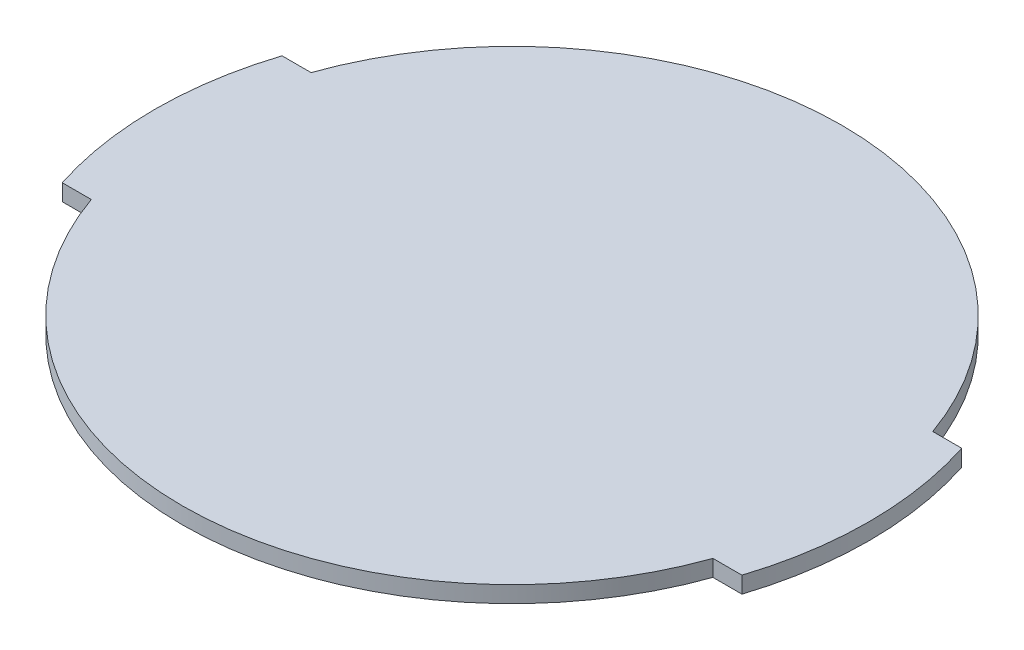
ISO-10303-21;
HEADER;
FILE_DESCRIPTION(('STEP AP214'),'2;1');
FILE_NAME('part.step','',(''),(''),'','','');
FILE_SCHEMA(('AUTOMOTIVE_DESIGN { 1 0 10303 214 1 1 1 1 }'));
ENDSEC;
DATA;
#1=APPLICATION_CONTEXT('core data for automotive mechanical design processes');
#2=APPLICATION_PROTOCOL_DEFINITION('international standard','automotive_design',2000,#1);
#3=PRODUCT_CONTEXT('',#1,'mechanical');
#4=PRODUCT('Part','Part','',(#3));
#5=PRODUCT_RELATED_PRODUCT_CATEGORY('part','',(#4));
#6=PRODUCT_DEFINITION_FORMATION('','',#4);
#7=PRODUCT_DEFINITION_CONTEXT('part definition',#1,'design');
#8=PRODUCT_DEFINITION('design','',#6,#7);
#9=PRODUCT_DEFINITION_SHAPE('','',#8);
#10=(LENGTH_UNIT() NAMED_UNIT(*) SI_UNIT(.MILLI.,.METRE.));
#11=(NAMED_UNIT(*) PLANE_ANGLE_UNIT() SI_UNIT($,.RADIAN.));
#12=(NAMED_UNIT(*) SI_UNIT($,.STERADIAN.) SOLID_ANGLE_UNIT());
#13=UNCERTAINTY_MEASURE_WITH_UNIT(LENGTH_MEASURE(1.E-05),#10,'distance_accuracy_value','');
#14=(GEOMETRIC_REPRESENTATION_CONTEXT(3) GLOBAL_UNCERTAINTY_ASSIGNED_CONTEXT((#13)) GLOBAL_UNIT_ASSIGNED_CONTEXT((#10,
#11,#12)) REPRESENTATION_CONTEXT('',''));
#15=CARTESIAN_POINT('',(0.,0.,0.));
#16=DIRECTION('',(0.,0.,1.));
#17=DIRECTION('',(1.,0.,0.));
#18=AXIS2_PLACEMENT_3D('',#15,#16,#17);
#19=CARTESIAN_POINT('',(0.,3.,0.));
#20=DIRECTION('',(0.,-1.,0.));
#21=DIRECTION('',(0.,0.,-1.));
#22=AXIS2_PLACEMENT_3D('',#19,#20,#21);
#23=CYLINDRICAL_SURFACE('',#22,65.);
#24=CARTESIAN_POINT('',(0.,0.,0.));
#25=DIRECTION('',(0.,1.,0.));
#26=DIRECTION('',(0.,0.,1.));
#27=AXIS2_PLACEMENT_3D('',#24,#25,#26);
#28=CIRCLE('',#27,65.);
#29=CARTESIAN_POINT('',(-61.8465843842649,0.,-20.));
#30=VERTEX_POINT('',#29);
#31=CARTESIAN_POINT('',(-61.8465843842649,0.,20.));
#32=VERTEX_POINT('',#31);
#33=EDGE_CURVE('E133',#30,#32,#28,.T.);
#34=ORIENTED_EDGE('',*,*,#33,.T.);
#35=DIRECTION('',(0.,-1.,0.));
#36=VECTOR('',#35,1.);
#37=CARTESIAN_POINT('',(-61.8465843842649,3.,20.));
#38=LINE('',#37,#36);
#39=CARTESIAN_POINT('',(-61.8465843842649,3.,20.));
#40=VERTEX_POINT('',#39);
#41=EDGE_CURVE('E11',#40,#32,#38,.T.);
#42=ORIENTED_EDGE('',*,*,#41,.F.);
#43=CARTESIAN_POINT('',(0.,3.,0.));
#44=DIRECTION('',(0.,1.,0.));
#45=DIRECTION('',(0.,0.,1.));
#46=AXIS2_PLACEMENT_3D('',#43,#44,#45);
#47=CIRCLE('',#46,65.);
#48=CARTESIAN_POINT('',(-61.8465843842649,3.,-20.));
#49=VERTEX_POINT('',#48);
#50=EDGE_CURVE('E147',#49,#40,#47,.T.);
#51=ORIENTED_EDGE('',*,*,#50,.F.);
#52=DIRECTION('',(0.,-1.,0.));
#53=VECTOR('',#52,1.);
#54=CARTESIAN_POINT('',(-61.8465843842649,3.,-20.));
#55=LINE('',#54,#53);
#56=EDGE_CURVE('E129',#49,#30,#55,.T.);
#57=ORIENTED_EDGE('',*,*,#56,.T.);
#58=EDGE_LOOP('',(#34,#42,#51,#57));
#59=FACE_BOUND('',#58,.T.);
#60=ADVANCED_FACE('F37',(#59),#23,.T.);
#61=CARTESIAN_POINT('',(-61.8465843842649,3.,20.));
#62=DIRECTION('',(0.,0.,-1.));
#63=DIRECTION('',(-1.,0.,0.));
#64=AXIS2_PLACEMENT_3D('',#61,#62,#63);
#65=PLANE('',#64);
#66=DIRECTION('',(1.,0.,0.));
#67=VECTOR('',#66,1.);
#68=CARTESIAN_POINT('',(-61.8465843842649,0.,20.));
#69=LINE('',#68,#67);
#70=CARTESIAN_POINT('',(-56.5685424949238,0.,20.));
#71=VERTEX_POINT('',#70);
#72=EDGE_CURVE('E136',#32,#71,#69,.T.);
#73=ORIENTED_EDGE('',*,*,#72,.T.);
#74=DIRECTION('',(0.,-1.,0.));
#75=VECTOR('',#74,1.);
#76=CARTESIAN_POINT('',(-56.5685424949238,3.,20.));
#77=LINE('',#76,#75);
#78=CARTESIAN_POINT('',(-56.5685424949238,3.,20.));
#79=VERTEX_POINT('',#78);
#80=EDGE_CURVE('E45',#79,#71,#77,.T.);
#81=ORIENTED_EDGE('',*,*,#80,.F.);
#82=DIRECTION('',(1.,0.,0.));
#83=VECTOR('',#82,1.);
#84=CARTESIAN_POINT('',(-61.8465843842649,3.,20.));
#85=LINE('',#84,#83);
#86=EDGE_CURVE('E96',#40,#79,#85,.T.);
#87=ORIENTED_EDGE('',*,*,#86,.F.);
#88=ORIENTED_EDGE('',*,*,#41,.T.);
#89=EDGE_LOOP('',(#73,#81,#87,#88));
#90=FACE_BOUND('',#89,.T.);
#91=ADVANCED_FACE('F182',(#90),#65,.F.);
#92=CARTESIAN_POINT('',(0.,3.,0.));
#93=DIRECTION('',(0.,-1.,0.));
#94=DIRECTION('',(0.,0.,-1.));
#95=AXIS2_PLACEMENT_3D('',#92,#93,#94);
#96=CYLINDRICAL_SURFACE('',#95,60.);
#97=CARTESIAN_POINT('',(0.,0.,0.));
#98=DIRECTION('',(0.,1.,0.));
#99=DIRECTION('',(0.,0.,1.));
#100=AXIS2_PLACEMENT_3D('',#97,#98,#99);
#101=CIRCLE('',#100,60.);
#102=CARTESIAN_POINT('',(56.5685424949238,0.,20.));
#103=VERTEX_POINT('',#102);
#104=EDGE_CURVE('E138',#71,#103,#101,.T.);
#105=ORIENTED_EDGE('',*,*,#104,.T.);
#106=DIRECTION('',(0.,-1.,0.));
#107=VECTOR('',#106,1.);
#108=CARTESIAN_POINT('',(56.5685424949238,3.,20.));
#109=LINE('',#108,#107);
#110=CARTESIAN_POINT('',(56.5685424949238,3.,20.));
#111=VERTEX_POINT('',#110);
#112=EDGE_CURVE('E154',#111,#103,#109,.T.);
#113=ORIENTED_EDGE('',*,*,#112,.F.);
#114=CARTESIAN_POINT('',(0.,3.,0.));
#115=DIRECTION('',(0.,1.,0.));
#116=DIRECTION('',(0.,0.,1.));
#117=AXIS2_PLACEMENT_3D('',#114,#115,#116);
#118=CIRCLE('',#117,60.);
#119=EDGE_CURVE('E162',#79,#111,#118,.T.);
#120=ORIENTED_EDGE('',*,*,#119,.F.);
#121=ORIENTED_EDGE('',*,*,#80,.T.);
#122=EDGE_LOOP('',(#105,#113,#120,#121));
#123=FACE_BOUND('',#122,.T.);
#124=ADVANCED_FACE('F160',(#123),#96,.T.);
#125=CARTESIAN_POINT('',(56.5685424949238,3.,20.));
#126=DIRECTION('',(0.,0.,-1.));
#127=DIRECTION('',(-1.,0.,0.));
#128=AXIS2_PLACEMENT_3D('',#125,#126,#127);
#129=PLANE('',#128);
#130=DIRECTION('',(1.,0.,0.));
#131=VECTOR('',#130,1.);
#132=CARTESIAN_POINT('',(56.5685424949238,0.,20.));
#133=LINE('',#132,#131);
#134=CARTESIAN_POINT('',(61.8465843842649,0.,20.));
#135=VERTEX_POINT('',#134);
#136=EDGE_CURVE('E140',#103,#135,#133,.T.);
#137=ORIENTED_EDGE('',*,*,#136,.T.);
#138=DIRECTION('',(0.,-1.,0.));
#139=VECTOR('',#138,1.);
#140=CARTESIAN_POINT('',(61.8465843842649,3.,20.));
#141=LINE('',#140,#139);
#142=CARTESIAN_POINT('',(61.8465843842649,3.,20.));
#143=VERTEX_POINT('',#142);
#144=EDGE_CURVE('E151',#143,#135,#141,.T.);
#145=ORIENTED_EDGE('',*,*,#144,.F.);
#146=DIRECTION('',(1.,0.,0.));
#147=VECTOR('',#146,1.);
#148=CARTESIAN_POINT('',(56.5685424949238,3.,20.));
#149=LINE('',#148,#147);
#150=EDGE_CURVE('E174',#111,#143,#149,.T.);
#151=ORIENTED_EDGE('',*,*,#150,.F.);
#152=ORIENTED_EDGE('',*,*,#112,.T.);
#153=EDGE_LOOP('',(#137,#145,#151,#152));
#154=FACE_BOUND('',#153,.T.);
#155=ADVANCED_FACE('F170',(#154),#129,.F.);
#156=CARTESIAN_POINT('',(0.,3.,0.));
#157=DIRECTION('',(0.,-1.,0.));
#158=DIRECTION('',(0.,0.,-1.));
#159=AXIS2_PLACEMENT_3D('',#156,#157,#158);
#160=CYLINDRICAL_SURFACE('',#159,65.);
#161=CARTESIAN_POINT('',(0.,0.,0.));
#162=DIRECTION('',(0.,1.,0.));
#163=DIRECTION('',(0.,0.,1.));
#164=AXIS2_PLACEMENT_3D('',#161,#162,#163);
#165=CIRCLE('',#164,65.);
#166=CARTESIAN_POINT('',(61.8465843842649,0.,-20.));
#167=VERTEX_POINT('',#166);
#168=EDGE_CURVE('E142',#135,#167,#165,.T.);
#169=ORIENTED_EDGE('',*,*,#168,.T.);
#170=DIRECTION('',(0.,-1.,0.));
#171=VECTOR('',#170,1.);
#172=CARTESIAN_POINT('',(61.8465843842649,3.,-20.));
#173=LINE('',#172,#171);
#174=CARTESIAN_POINT('',(61.8465843842649,3.,-20.));
#175=VERTEX_POINT('',#174);
#176=EDGE_CURVE('E124',#175,#167,#173,.T.);
#177=ORIENTED_EDGE('',*,*,#176,.F.);
#178=CARTESIAN_POINT('',(0.,3.,0.));
#179=DIRECTION('',(0.,1.,0.));
#180=DIRECTION('',(0.,0.,1.));
#181=AXIS2_PLACEMENT_3D('',#178,#179,#180);
#182=CIRCLE('',#181,65.);
#183=EDGE_CURVE('E115',#143,#175,#182,.T.);
#184=ORIENTED_EDGE('',*,*,#183,.F.);
#185=ORIENTED_EDGE('',*,*,#144,.T.);
#186=EDGE_LOOP('',(#169,#177,#184,#185));
#187=FACE_BOUND('',#186,.T.);
#188=ADVANCED_FACE('F173',(#187),#160,.T.);
#189=CARTESIAN_POINT('',(56.5685424949238,3.,-20.));
#190=DIRECTION('',(0.,0.,1.));
#191=DIRECTION('',(1.,0.,0.));
#192=AXIS2_PLACEMENT_3D('',#189,#190,#191);
#193=PLANE('',#192);
#194=DIRECTION('',(-1.,0.,0.));
#195=VECTOR('',#194,1.);
#196=CARTESIAN_POINT('',(56.5685424949238,0.,-20.));
#197=LINE('',#196,#195);
#198=CARTESIAN_POINT('',(56.5685424949238,0.,-20.));
#199=VERTEX_POINT('',#198);
#200=EDGE_CURVE('E123',#167,#199,#197,.T.);
#201=ORIENTED_EDGE('',*,*,#200,.T.);
#202=DIRECTION('',(0.,-1.,0.));
#203=VECTOR('',#202,1.);
#204=CARTESIAN_POINT('',(56.5685424949238,3.,-20.));
#205=LINE('',#204,#203);
#206=CARTESIAN_POINT('',(56.5685424949238,3.,-20.));
#207=VERTEX_POINT('',#206);
#208=EDGE_CURVE('E120',#207,#199,#205,.T.);
#209=ORIENTED_EDGE('',*,*,#208,.F.);
#210=DIRECTION('',(-1.,0.,0.));
#211=VECTOR('',#210,1.);
#212=CARTESIAN_POINT('',(56.5685424949238,3.,-20.));
#213=LINE('',#212,#211);
#214=EDGE_CURVE('E109',#175,#207,#213,.T.);
#215=ORIENTED_EDGE('',*,*,#214,.F.);
#216=ORIENTED_EDGE('',*,*,#176,.T.);
#217=EDGE_LOOP('',(#201,#209,#215,#216));
#218=FACE_BOUND('',#217,.T.);
#219=ADVANCED_FACE('F121',(#218),#193,.F.);
#220=CARTESIAN_POINT('',(0.,3.,0.));
#221=DIRECTION('',(0.,-1.,0.));
#222=DIRECTION('',(0.,0.,-1.));
#223=AXIS2_PLACEMENT_3D('',#220,#221,#222);
#224=CYLINDRICAL_SURFACE('',#223,60.);
#225=CARTESIAN_POINT('',(0.,0.,0.));
#226=DIRECTION('',(0.,1.,0.));
#227=DIRECTION('',(0.,0.,1.));
#228=AXIS2_PLACEMENT_3D('',#225,#226,#227);
#229=CIRCLE('',#228,60.);
#230=CARTESIAN_POINT('',(-56.5685424949238,0.,-20.));
#231=VERTEX_POINT('',#230);
#232=EDGE_CURVE('E82',#199,#231,#229,.T.);
#233=ORIENTED_EDGE('',*,*,#232,.T.);
#234=DIRECTION('',(0.,-1.,0.));
#235=VECTOR('',#234,1.);
#236=CARTESIAN_POINT('',(-56.5685424949238,3.,-20.));
#237=LINE('',#236,#235);
#238=CARTESIAN_POINT('',(-56.5685424949238,3.,-20.));
#239=VERTEX_POINT('',#238);
#240=EDGE_CURVE('E125',#239,#231,#237,.T.);
#241=ORIENTED_EDGE('',*,*,#240,.F.);
#242=CARTESIAN_POINT('',(0.,3.,0.));
#243=DIRECTION('',(0.,1.,0.));
#244=DIRECTION('',(0.,0.,1.));
#245=AXIS2_PLACEMENT_3D('',#242,#243,#244);
#246=CIRCLE('',#245,60.);
#247=EDGE_CURVE('E113',#207,#239,#246,.T.);
#248=ORIENTED_EDGE('',*,*,#247,.F.);
#249=ORIENTED_EDGE('',*,*,#208,.T.);
#250=EDGE_LOOP('',(#233,#241,#248,#249));
#251=FACE_BOUND('',#250,.T.);
#252=ADVANCED_FACE('F127',(#251),#224,.T.);
#253=CARTESIAN_POINT('',(-61.8465843842649,3.,-20.));
#254=DIRECTION('',(0.,0.,1.));
#255=DIRECTION('',(1.,0.,0.));
#256=AXIS2_PLACEMENT_3D('',#253,#254,#255);
#257=PLANE('',#256);
#258=DIRECTION('',(-1.,0.,0.));
#259=VECTOR('',#258,1.);
#260=CARTESIAN_POINT('',(-61.8465843842649,0.,-20.));
#261=LINE('',#260,#259);
#262=EDGE_CURVE('E88',#231,#30,#261,.T.);
#263=ORIENTED_EDGE('',*,*,#262,.T.);
#264=ORIENTED_EDGE('',*,*,#56,.F.);
#265=DIRECTION('',(-1.,0.,0.));
#266=VECTOR('',#265,1.);
#267=CARTESIAN_POINT('',(-61.8465843842649,3.,-20.));
#268=LINE('',#267,#266);
#269=EDGE_CURVE('E53',#239,#49,#268,.T.);
#270=ORIENTED_EDGE('',*,*,#269,.F.);
#271=ORIENTED_EDGE('',*,*,#240,.T.);
#272=EDGE_LOOP('',(#263,#264,#270,#271));
#273=FACE_BOUND('',#272,.T.);
#274=ADVANCED_FACE('F198',(#273),#257,.F.);
#275=CARTESIAN_POINT('',(0.,3.,0.));
#276=DIRECTION('',(0.,1.,0.));
#277=DIRECTION('',(0.,0.,1.));
#278=AXIS2_PLACEMENT_3D('',#275,#276,#277);
#279=PLANE('',#278);
#280=ORIENTED_EDGE('',*,*,#50,.T.);
#281=ORIENTED_EDGE('',*,*,#86,.T.);
#282=ORIENTED_EDGE('',*,*,#119,.T.);
#283=ORIENTED_EDGE('',*,*,#150,.T.);
#284=ORIENTED_EDGE('',*,*,#183,.T.);
#285=ORIENTED_EDGE('',*,*,#214,.T.);
#286=ORIENTED_EDGE('',*,*,#247,.T.);
#287=ORIENTED_EDGE('',*,*,#269,.T.);
#288=EDGE_LOOP('',(#280,#281,#282,#283,#284,#285,#286,#287));
#289=FACE_BOUND('',#288,.T.);
#290=ADVANCED_FACE('F111',(#289),#279,.T.);
#291=CARTESIAN_POINT('',(0.,0.,0.));
#292=DIRECTION('',(0.,1.,0.));
#293=DIRECTION('',(0.,0.,1.));
#294=AXIS2_PLACEMENT_3D('',#291,#292,#293);
#295=PLANE('',#294);
#296=ORIENTED_EDGE('',*,*,#33,.F.);
#297=ORIENTED_EDGE('',*,*,#262,.F.);
#298=ORIENTED_EDGE('',*,*,#232,.F.);
#299=ORIENTED_EDGE('',*,*,#200,.F.);
#300=ORIENTED_EDGE('',*,*,#168,.F.);
#301=ORIENTED_EDGE('',*,*,#136,.F.);
#302=ORIENTED_EDGE('',*,*,#104,.F.);
#303=ORIENTED_EDGE('',*,*,#72,.F.);
#304=EDGE_LOOP('',(#296,#297,#298,#299,#300,#301,#302,#303));
#305=FACE_BOUND('',#304,.T.);
#306=ADVANCED_FACE('F166',(#305),#295,.F.);
#307=CLOSED_SHELL('',(#60,#91,#124,#155,#188,#219,#252,#274,#290,#306));
#308=MANIFOLD_SOLID_BREP('B2',#307);
#309=ADVANCED_BREP_SHAPE_REPRESENTATION('',(#18,#308),#14);
#310=SHAPE_DEFINITION_REPRESENTATION(#9,#309);
ENDSEC;
END-ISO-10303-21;
